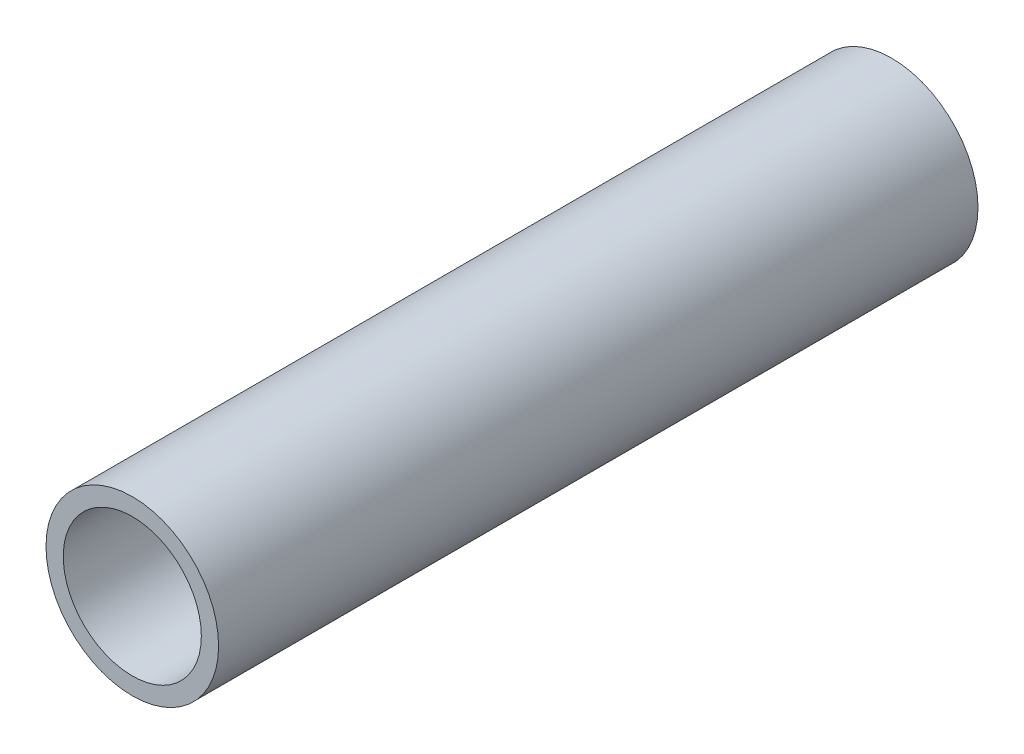
ISO-10303-21;
HEADER;
FILE_DESCRIPTION(('STEP AP214'),'2;1');
FILE_NAME('part.step','',(''),(''),'','','');
FILE_SCHEMA(('AUTOMOTIVE_DESIGN { 1 0 10303 214 1 1 1 1 }'));
ENDSEC;
DATA;
#1=APPLICATION_CONTEXT('core data for automotive mechanical design processes');
#2=APPLICATION_PROTOCOL_DEFINITION('international standard','automotive_design',2000,#1);
#3=PRODUCT_CONTEXT('',#1,'mechanical');
#4=PRODUCT('Part','Part','',(#3));
#5=PRODUCT_RELATED_PRODUCT_CATEGORY('part','',(#4));
#6=PRODUCT_DEFINITION_FORMATION('','',#4);
#7=PRODUCT_DEFINITION_CONTEXT('part definition',#1,'design');
#8=PRODUCT_DEFINITION('design','',#6,#7);
#9=PRODUCT_DEFINITION_SHAPE('','',#8);
#10=(LENGTH_UNIT() NAMED_UNIT(*) SI_UNIT(.MILLI.,.METRE.));
#11=(NAMED_UNIT(*) PLANE_ANGLE_UNIT() SI_UNIT($,.RADIAN.));
#12=(NAMED_UNIT(*) SI_UNIT($,.STERADIAN.) SOLID_ANGLE_UNIT());
#13=UNCERTAINTY_MEASURE_WITH_UNIT(LENGTH_MEASURE(1.E-05),#10,'distance_accuracy_value','');
#14=(GEOMETRIC_REPRESENTATION_CONTEXT(3) GLOBAL_UNCERTAINTY_ASSIGNED_CONTEXT((#13)) GLOBAL_UNIT_ASSIGNED_CONTEXT((#10,
#11,#12)) REPRESENTATION_CONTEXT('',''));
#15=CARTESIAN_POINT('',(0.,0.,0.));
#16=DIRECTION('',(0.,0.,1.));
#17=DIRECTION('',(1.,0.,0.));
#18=AXIS2_PLACEMENT_3D('',#15,#16,#17);
#19=CARTESIAN_POINT('',(0.,0.,11.));
#20=DIRECTION('',(0.,0.,-1.));
#21=DIRECTION('',(1.,0.,0.));
#22=AXIS2_PLACEMENT_3D('',#19,#20,#21);
#23=CYLINDRICAL_SURFACE('',#22,1.);
#24=CARTESIAN_POINT('',(0.,0.,11.));
#25=DIRECTION('',(0.,0.,1.));
#26=DIRECTION('',(1.,0.,0.));
#27=AXIS2_PLACEMENT_3D('',#24,#25,#26);
#28=CIRCLE('',#27,1.);
#29=CARTESIAN_POINT('',(1.,0.,11.));
#30=VERTEX_POINT('',#29);
#31=EDGE_CURVE('E54',#30,#30,#28,.T.);
#32=ORIENTED_EDGE('',*,*,#31,.T.);
#33=DIRECTION('',(0.,0.,-1.));
#34=VECTOR('',#33,1.);
#35=CARTESIAN_POINT('',(1.,0.,11.));
#36=LINE('',#35,#34);
#37=CARTESIAN_POINT('',(1.,0.,0.));
#38=VERTEX_POINT('',#37);
#39=EDGE_CURVE('E10',#30,#38,#36,.T.);
#40=ORIENTED_EDGE('',*,*,#39,.T.);
#41=CARTESIAN_POINT('',(0.,0.,0.));
#42=DIRECTION('',(0.,0.,1.));
#43=DIRECTION('',(1.,0.,0.));
#44=AXIS2_PLACEMENT_3D('',#41,#42,#43);
#45=CIRCLE('',#44,1.);
#46=EDGE_CURVE('E64',#38,#38,#45,.T.);
#47=ORIENTED_EDGE('',*,*,#46,.F.);
#48=ORIENTED_EDGE('',*,*,#39,.F.);
#49=EDGE_LOOP('',(#32,#40,#47,#48));
#50=FACE_BOUND('',#49,.T.);
#51=ADVANCED_FACE('F15',(#50),#23,.F.);
#52=CARTESIAN_POINT('',(0.,0.,0.));
#53=DIRECTION('',(0.,0.,1.));
#54=DIRECTION('',(1.,0.,0.));
#55=AXIS2_PLACEMENT_3D('',#52,#53,#54);
#56=CYLINDRICAL_SURFACE('',#55,1.25);
#57=CARTESIAN_POINT('',(0.,0.,0.));
#58=DIRECTION('',(0.,0.,1.));
#59=DIRECTION('',(1.,0.,0.));
#60=AXIS2_PLACEMENT_3D('',#57,#58,#59);
#61=CIRCLE('',#60,1.25);
#62=CARTESIAN_POINT('',(1.25,0.,0.));
#63=VERTEX_POINT('',#62);
#64=EDGE_CURVE('E55',#63,#63,#61,.T.);
#65=ORIENTED_EDGE('',*,*,#64,.T.);
#66=DIRECTION('',(0.,0.,1.));
#67=VECTOR('',#66,1.);
#68=CARTESIAN_POINT('',(1.25,0.,0.));
#69=LINE('',#68,#67);
#70=CARTESIAN_POINT('',(1.25,0.,11.));
#71=VERTEX_POINT('',#70);
#72=EDGE_CURVE('E18',#63,#71,#69,.T.);
#73=ORIENTED_EDGE('',*,*,#72,.T.);
#74=CARTESIAN_POINT('',(0.,0.,11.));
#75=DIRECTION('',(0.,0.,1.));
#76=DIRECTION('',(1.,0.,0.));
#77=AXIS2_PLACEMENT_3D('',#74,#75,#76);
#78=CIRCLE('',#77,1.25);
#79=EDGE_CURVE('E52',#71,#71,#78,.T.);
#80=ORIENTED_EDGE('',*,*,#79,.F.);
#81=ORIENTED_EDGE('',*,*,#72,.F.);
#82=EDGE_LOOP('',(#65,#73,#80,#81));
#83=FACE_BOUND('',#82,.T.);
#84=ADVANCED_FACE('F49',(#83),#56,.T.);
#85=CARTESIAN_POINT('',(-0.3349364905389,0.,11.));
#86=DIRECTION('',(0.,0.,1.));
#87=DIRECTION('',(1.,0.,0.));
#88=AXIS2_PLACEMENT_3D('',#85,#86,#87);
#89=PLANE('',#88);
#90=ORIENTED_EDGE('',*,*,#31,.F.);
#91=EDGE_LOOP('',(#90));
#92=FACE_BOUND('',#91,.T.);
#93=ORIENTED_EDGE('',*,*,#79,.T.);
#94=EDGE_LOOP('',(#93));
#95=FACE_BOUND('',#94,.T.);
#96=ADVANCED_FACE('F83',(#92,#95),#89,.T.);
#97=CARTESIAN_POINT('',(-0.3349364905389,0.,0.));
#98=DIRECTION('',(0.,0.,1.));
#99=DIRECTION('',(1.,0.,0.));
#100=AXIS2_PLACEMENT_3D('',#97,#98,#99);
#101=PLANE('',#100);
#102=ORIENTED_EDGE('',*,*,#46,.T.);
#103=EDGE_LOOP('',(#102));
#104=FACE_BOUND('',#103,.T.);
#105=ORIENTED_EDGE('',*,*,#64,.F.);
#106=EDGE_LOOP('',(#105));
#107=FACE_BOUND('',#106,.T.);
#108=ADVANCED_FACE('F76',(#104,#107),#101,.F.);
#109=CLOSED_SHELL('',(#51,#84,#96,#108));
#110=MANIFOLD_SOLID_BREP('B1',#109);
#111=ADVANCED_BREP_SHAPE_REPRESENTATION('',(#18,#110),#14);
#112=SHAPE_DEFINITION_REPRESENTATION(#9,#111);
ENDSEC;
END-ISO-10303-21;
